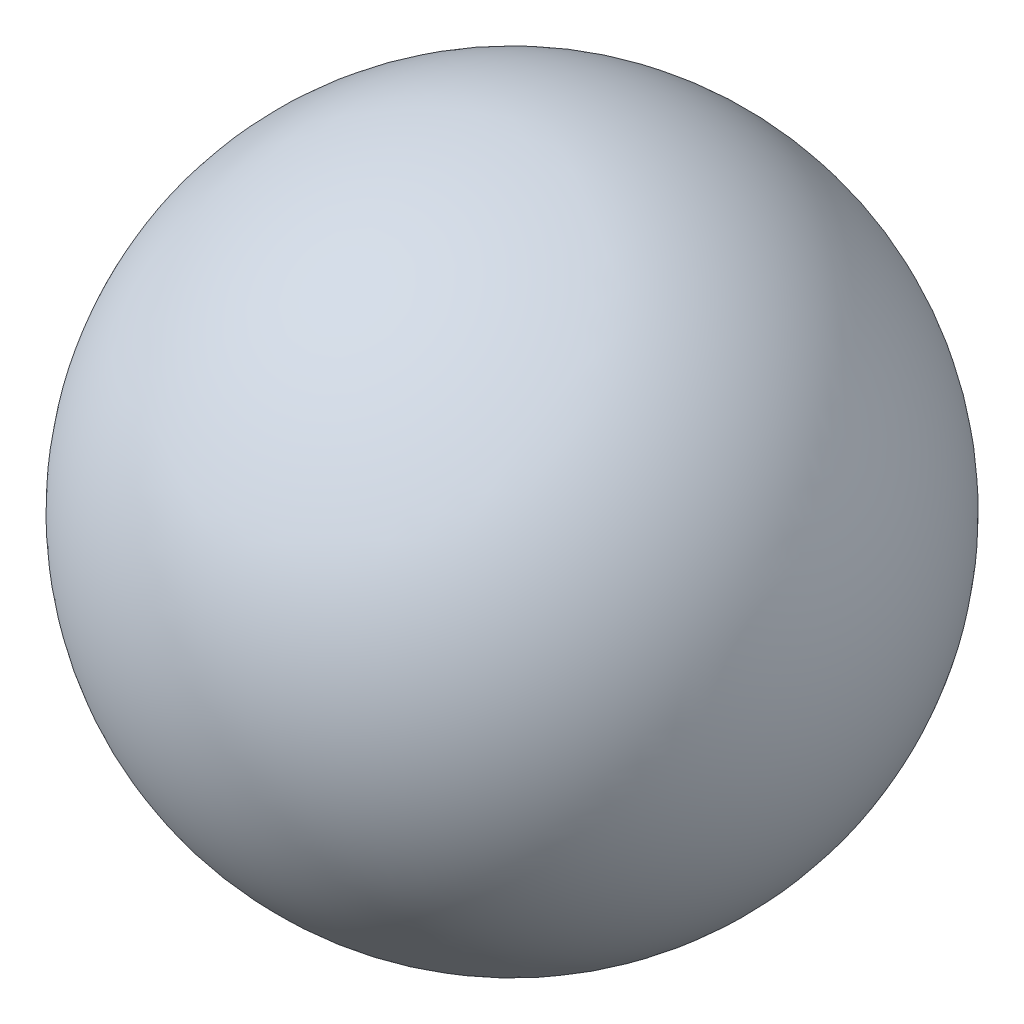
ISO-10303-21;
HEADER;
FILE_DESCRIPTION(('STEP AP214'),'2;1');
FILE_NAME('part.step','',(''),(''),'','','');
FILE_SCHEMA(('AUTOMOTIVE_DESIGN { 1 0 10303 214 1 1 1 1 }'));
ENDSEC;
DATA;
#1=APPLICATION_CONTEXT('core data for automotive mechanical design processes');
#2=APPLICATION_PROTOCOL_DEFINITION('international standard','automotive_design',2000,#1);
#3=PRODUCT_CONTEXT('',#1,'mechanical');
#4=PRODUCT('Part','Part','',(#3));
#5=PRODUCT_RELATED_PRODUCT_CATEGORY('part','',(#4));
#6=PRODUCT_DEFINITION_FORMATION('','',#4);
#7=PRODUCT_DEFINITION_CONTEXT('part definition',#1,'design');
#8=PRODUCT_DEFINITION('design','',#6,#7);
#9=PRODUCT_DEFINITION_SHAPE('','',#8);
#10=(LENGTH_UNIT() NAMED_UNIT(*) SI_UNIT(.MILLI.,.METRE.));
#11=(NAMED_UNIT(*) PLANE_ANGLE_UNIT() SI_UNIT($,.RADIAN.));
#12=(NAMED_UNIT(*) SI_UNIT($,.STERADIAN.) SOLID_ANGLE_UNIT());
#13=UNCERTAINTY_MEASURE_WITH_UNIT(LENGTH_MEASURE(1.E-05),#10,'distance_accuracy_value','');
#14=(GEOMETRIC_REPRESENTATION_CONTEXT(3) GLOBAL_UNCERTAINTY_ASSIGNED_CONTEXT((#13)) GLOBAL_UNIT_ASSIGNED_CONTEXT((#10,
#11,#12)) REPRESENTATION_CONTEXT('',''));
#15=CARTESIAN_POINT('',(0.,0.,0.));
#16=DIRECTION('',(0.,0.,1.));
#17=DIRECTION('',(1.,0.,0.));
#18=AXIS2_PLACEMENT_3D('',#15,#16,#17);
#19=CARTESIAN_POINT('',(0.,0.,0.));
#20=DIRECTION('',(1.,0.,0.));
#21=DIRECTION('',(0.,-1.,0.));
#22=AXIS2_PLACEMENT_3D('',#19,#20,#21);
#23=SPHERICAL_SURFACE('',#22,12.);
#24=CARTESIAN_POINT('',(12.,0.,0.));
#25=VERTEX_POINT('',#24);
#26=VERTEX_LOOP('',#25);
#27=FACE_BOUND('',#26,.T.);
#28=ADVANCED_FACE('F36',(#27),#23,.T.);
#29=CLOSED_SHELL('',(#28));
#30=MANIFOLD_SOLID_BREP('B2',#29);
#31=ADVANCED_BREP_SHAPE_REPRESENTATION('',(#18,#30),#14);
#32=SHAPE_DEFINITION_REPRESENTATION(#9,#31);
ENDSEC;
END-ISO-10303-21;
